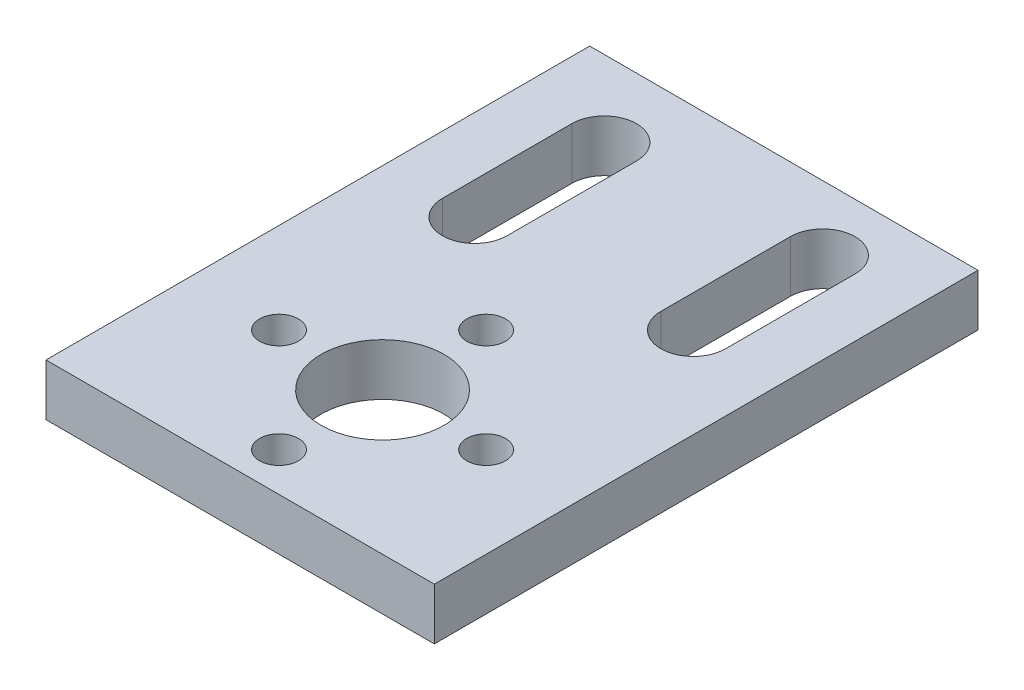
ISO-10303-21;
HEADER;
FILE_DESCRIPTION(('STEP AP214'),'2;1');
FILE_NAME('part.step','',(''),(''),'','','');
FILE_SCHEMA(('AUTOMOTIVE_DESIGN { 1 0 10303 214 1 1 1 1 }'));
ENDSEC;
DATA;
#1=APPLICATION_CONTEXT('core data for automotive mechanical design processes');
#2=APPLICATION_PROTOCOL_DEFINITION('international standard','automotive_design',2000,#1);
#3=PRODUCT_CONTEXT('',#1,'mechanical');
#4=PRODUCT('Part','Part','',(#3));
#5=PRODUCT_RELATED_PRODUCT_CATEGORY('part','',(#4));
#6=PRODUCT_DEFINITION_FORMATION('','',#4);
#7=PRODUCT_DEFINITION_CONTEXT('part definition',#1,'design');
#8=PRODUCT_DEFINITION('design','',#6,#7);
#9=PRODUCT_DEFINITION_SHAPE('','',#8);
#10=(LENGTH_UNIT() NAMED_UNIT(*) SI_UNIT(.MILLI.,.METRE.));
#11=(NAMED_UNIT(*) PLANE_ANGLE_UNIT() SI_UNIT($,.RADIAN.));
#12=(NAMED_UNIT(*) SI_UNIT($,.STERADIAN.) SOLID_ANGLE_UNIT());
#13=UNCERTAINTY_MEASURE_WITH_UNIT(LENGTH_MEASURE(1.E-05),#10,'distance_accuracy_value','');
#14=(GEOMETRIC_REPRESENTATION_CONTEXT(3) GLOBAL_UNCERTAINTY_ASSIGNED_CONTEXT((#13)) GLOBAL_UNIT_ASSIGNED_CONTEXT((#10,
#11,#12)) REPRESENTATION_CONTEXT('',''));
#15=CARTESIAN_POINT('',(0.,0.,0.));
#16=DIRECTION('',(0.,0.,1.));
#17=DIRECTION('',(1.,0.,0.));
#18=AXIS2_PLACEMENT_3D('',#15,#16,#17);
#19=CARTESIAN_POINT('',(0.,4.,0.));
#20=DIRECTION('',(0.,-1.,0.));
#21=DIRECTION('',(0.,0.,-1.));
#22=AXIS2_PLACEMENT_3D('',#19,#20,#21);
#23=PLANE('',#22);
#24=CARTESIAN_POINT('',(-7.99999999999989,4.,-14.1184202899468));
#25=DIRECTION('',(0.,1.,0.));
#26=DIRECTION('',(0.,0.,1.));
#27=AXIS2_PLACEMENT_3D('',#24,#25,#26);
#28=CIRCLE('',#27,2.5);
#29=CARTESIAN_POINT('',(-5.49999999999988,4.,-14.1184202899468));
#30=VERTEX_POINT('',#29);
#31=CARTESIAN_POINT('',(-10.4999999999999,4.,-14.1184202899468));
#32=VERTEX_POINT('',#31);
#33=EDGE_CURVE('E161',#30,#32,#28,.T.);
#34=ORIENTED_EDGE('',*,*,#33,.F.);
#35=DIRECTION('',(0.,0.,-1.));
#36=VECTOR('',#35,1.);
#37=CARTESIAN_POINT('',(-5.49999999999988,4.,-14.1184202899468));
#38=LINE('',#37,#36);
#39=CARTESIAN_POINT('',(-5.49999999999989,4.,-4.11842028994677));
#40=VERTEX_POINT('',#39);
#41=EDGE_CURVE('E169',#40,#30,#38,.T.);
#42=ORIENTED_EDGE('',*,*,#41,.F.);
#43=CARTESIAN_POINT('',(-7.99999999999989,4.,-4.11842028994677));
#44=DIRECTION('',(0.,1.,0.));
#45=DIRECTION('',(0.,0.,1.));
#46=AXIS2_PLACEMENT_3D('',#43,#44,#45);
#47=CIRCLE('',#46,2.5);
#48=CARTESIAN_POINT('',(-10.4999999999999,4.,-4.11842028994677));
#49=VERTEX_POINT('',#48);
#50=EDGE_CURVE('E166',#49,#40,#47,.T.);
#51=ORIENTED_EDGE('',*,*,#50,.F.);
#52=DIRECTION('',(0.,0.,1.));
#53=VECTOR('',#52,1.);
#54=CARTESIAN_POINT('',(-10.4999999999999,4.,-14.1184202899468));
#55=LINE('',#54,#53);
#56=EDGE_CURVE('E163',#32,#49,#55,.T.);
#57=ORIENTED_EDGE('',*,*,#56,.F.);
#58=EDGE_LOOP('',(#34,#42,#51,#57));
#59=FACE_BOUND('',#58,.T.);
#60=DIRECTION('',(0.,0.,1.));
#61=VECTOR('',#60,1.);
#62=CARTESIAN_POINT('',(-15.,4.,-20.));
#63=LINE('',#62,#61);
#64=CARTESIAN_POINT('',(-15.,4.,-20.));
#65=VERTEX_POINT('',#64);
#66=CARTESIAN_POINT('',(-15.,4.,22.));
#67=VERTEX_POINT('',#66);
#68=EDGE_CURVE('E222',#65,#67,#63,.T.);
#69=ORIENTED_EDGE('',*,*,#68,.T.);
#70=DIRECTION('',(1.,0.,0.));
#71=VECTOR('',#70,1.);
#72=CARTESIAN_POINT('',(15.,4.,22.));
#73=LINE('',#72,#71);
#74=CARTESIAN_POINT('',(15.,4.,22.));
#75=VERTEX_POINT('',#74);
#76=EDGE_CURVE('E225',#67,#75,#73,.T.);
#77=ORIENTED_EDGE('',*,*,#76,.T.);
#78=DIRECTION('',(0.,0.,-1.));
#79=VECTOR('',#78,1.);
#80=CARTESIAN_POINT('',(15.,4.,-20.));
#81=LINE('',#80,#79);
#82=CARTESIAN_POINT('',(15.,4.,-20.));
#83=VERTEX_POINT('',#82);
#84=EDGE_CURVE('E228',#75,#83,#81,.T.);
#85=ORIENTED_EDGE('',*,*,#84,.T.);
#86=DIRECTION('',(-1.,0.,0.));
#87=VECTOR('',#86,1.);
#88=CARTESIAN_POINT('',(15.,4.,-20.));
#89=LINE('',#88,#87);
#90=EDGE_CURVE('E230',#83,#65,#89,.T.);
#91=ORIENTED_EDGE('',*,*,#90,.T.);
#92=EDGE_LOOP('',(#69,#77,#85,#91));
#93=FACE_BOUND('',#92,.T.);
#94=CARTESIAN_POINT('',(0.,4.,11.));
#95=DIRECTION('',(0.,1.,0.));
#96=DIRECTION('',(0.,0.,1.));
#97=AXIS2_PLACEMENT_3D('',#94,#95,#96);
#98=CIRCLE('',#97,4.75);
#99=CARTESIAN_POINT('',(0.,4.,15.75));
#100=VERTEX_POINT('',#99);
#101=EDGE_CURVE('E216',#100,#100,#98,.T.);
#102=ORIENTED_EDGE('',*,*,#101,.F.);
#103=EDGE_LOOP('',(#102));
#104=FACE_BOUND('',#103,.T.);
#105=CARTESIAN_POINT('',(0.,4.,3.));
#106=DIRECTION('',(0.,1.,0.));
#107=DIRECTION('',(0.,0.,1.));
#108=AXIS2_PLACEMENT_3D('',#105,#106,#107);
#109=CIRCLE('',#108,1.5);
#110=CARTESIAN_POINT('',(0.,4.,4.5));
#111=VERTEX_POINT('',#110);
#112=EDGE_CURVE('E210',#111,#111,#109,.T.);
#113=ORIENTED_EDGE('',*,*,#112,.F.);
#114=EDGE_LOOP('',(#113));
#115=FACE_BOUND('',#114,.T.);
#116=CARTESIAN_POINT('',(8.00000000000011,4.,10.9999999999999));
#117=DIRECTION('',(0.,1.,0.));
#118=DIRECTION('',(0.,0.,1.));
#119=AXIS2_PLACEMENT_3D('',#116,#117,#118);
#120=CIRCLE('',#119,1.5);
#121=CARTESIAN_POINT('',(8.00000000000011,4.,12.4999999999999));
#122=VERTEX_POINT('',#121);
#123=EDGE_CURVE('E204',#122,#122,#120,.T.);
#124=ORIENTED_EDGE('',*,*,#123,.F.);
#125=EDGE_LOOP('',(#124));
#126=FACE_BOUND('',#125,.T.);
#127=CARTESIAN_POINT('',(1.68570821703788E-13,4.,19.));
#128=DIRECTION('',(0.,1.,0.));
#129=DIRECTION('',(0.,0.,1.));
#130=AXIS2_PLACEMENT_3D('',#127,#128,#129);
#131=CIRCLE('',#130,1.5);
#132=CARTESIAN_POINT('',(1.68570821703788E-13,4.,20.5));
#133=VERTEX_POINT('',#132);
#134=EDGE_CURVE('E198',#133,#133,#131,.T.);
#135=ORIENTED_EDGE('',*,*,#134,.F.);
#136=EDGE_LOOP('',(#135));
#137=FACE_BOUND('',#136,.T.);
#138=CARTESIAN_POINT('',(-7.99999999999989,4.,11.));
#139=DIRECTION('',(0.,1.,0.));
#140=DIRECTION('',(0.,0.,1.));
#141=AXIS2_PLACEMENT_3D('',#138,#139,#140);
#142=CIRCLE('',#141,1.5);
#143=CARTESIAN_POINT('',(-7.99999999999989,4.,12.5));
#144=VERTEX_POINT('',#143);
#145=EDGE_CURVE('E192',#144,#144,#142,.T.);
#146=ORIENTED_EDGE('',*,*,#145,.F.);
#147=EDGE_LOOP('',(#146));
#148=FACE_BOUND('',#147,.T.);
#149=CARTESIAN_POINT('',(8.00000000000012,4.,-15.));
#150=DIRECTION('',(0.,1.,0.));
#151=DIRECTION('',(0.,0.,1.));
#152=AXIS2_PLACEMENT_3D('',#149,#150,#151);
#153=CIRCLE('',#152,2.5);
#154=CARTESIAN_POINT('',(10.5000000000001,4.,-15.));
#155=VERTEX_POINT('',#154);
#156=CARTESIAN_POINT('',(5.50000000000011,4.,-15.));
#157=VERTEX_POINT('',#156);
#158=EDGE_CURVE('E125',#155,#157,#153,.T.);
#159=ORIENTED_EDGE('',*,*,#158,.F.);
#160=DIRECTION('',(0.,0.,-1.));
#161=VECTOR('',#160,1.);
#162=CARTESIAN_POINT('',(10.5000000000001,4.,-15.));
#163=LINE('',#162,#161);
#164=CARTESIAN_POINT('',(10.5000000000001,4.,-5.));
#165=VERTEX_POINT('',#164);
#166=EDGE_CURVE('E147',#165,#155,#163,.T.);
#167=ORIENTED_EDGE('',*,*,#166,.F.);
#168=CARTESIAN_POINT('',(8.00000000000012,4.,-5.));
#169=DIRECTION('',(0.,1.,0.));
#170=DIRECTION('',(0.,0.,1.));
#171=AXIS2_PLACEMENT_3D('',#168,#169,#170);
#172=CIRCLE('',#171,2.5);
#173=CARTESIAN_POINT('',(5.50000000000012,4.,-5.));
#174=VERTEX_POINT('',#173);
#175=EDGE_CURVE('E145',#174,#165,#172,.T.);
#176=ORIENTED_EDGE('',*,*,#175,.F.);
#177=DIRECTION('',(0.,0.,1.));
#178=VECTOR('',#177,1.);
#179=CARTESIAN_POINT('',(5.50000000000011,4.,-15.));
#180=LINE('',#179,#178);
#181=EDGE_CURVE('E133',#157,#174,#180,.T.);
#182=ORIENTED_EDGE('',*,*,#181,.F.);
#183=EDGE_LOOP('',(#159,#167,#176,#182));
#184=FACE_BOUND('',#183,.T.);
#185=ADVANCED_FACE('F36',(#59,#93,#104,#115,#126,#137,#148,#184),#23,.F.);
#186=CARTESIAN_POINT('',(0.,0.,0.));
#187=DIRECTION('',(0.,-1.,0.));
#188=DIRECTION('',(0.,0.,-1.));
#189=AXIS2_PLACEMENT_3D('',#186,#187,#188);
#190=PLANE('',#189);
#191=CARTESIAN_POINT('',(1.68570821703788E-13,0.,19.));
#192=DIRECTION('',(0.,1.,0.));
#193=DIRECTION('',(0.,0.,1.));
#194=AXIS2_PLACEMENT_3D('',#191,#192,#193);
#195=CIRCLE('',#194,1.5);
#196=CARTESIAN_POINT('',(1.68570821703788E-13,0.,20.5));
#197=VERTEX_POINT('',#196);
#198=EDGE_CURVE('E195',#197,#197,#195,.T.);
#199=ORIENTED_EDGE('',*,*,#198,.T.);
#200=EDGE_LOOP('',(#199));
#201=FACE_BOUND('',#200,.T.);
#202=CARTESIAN_POINT('',(0.,0.,3.));
#203=DIRECTION('',(0.,1.,0.));
#204=DIRECTION('',(0.,0.,1.));
#205=AXIS2_PLACEMENT_3D('',#202,#203,#204);
#206=CIRCLE('',#205,1.5);
#207=CARTESIAN_POINT('',(0.,0.,4.5));
#208=VERTEX_POINT('',#207);
#209=EDGE_CURVE('E207',#208,#208,#206,.T.);
#210=ORIENTED_EDGE('',*,*,#209,.T.);
#211=EDGE_LOOP('',(#210));
#212=FACE_BOUND('',#211,.T.);
#213=DIRECTION('',(0.,0.,1.));
#214=VECTOR('',#213,1.);
#215=CARTESIAN_POINT('',(-15.,0.,-20.));
#216=LINE('',#215,#214);
#217=CARTESIAN_POINT('',(-15.,0.,-20.));
#218=VERTEX_POINT('',#217);
#219=CARTESIAN_POINT('',(-15.,0.,22.));
#220=VERTEX_POINT('',#219);
#221=EDGE_CURVE('E219',#218,#220,#216,.T.);
#222=ORIENTED_EDGE('',*,*,#221,.F.);
#223=DIRECTION('',(-1.,0.,0.));
#224=VECTOR('',#223,1.);
#225=CARTESIAN_POINT('',(15.,0.,-20.));
#226=LINE('',#225,#224);
#227=CARTESIAN_POINT('',(15.,0.,-20.));
#228=VERTEX_POINT('',#227);
#229=EDGE_CURVE('E226',#228,#218,#226,.T.);
#230=ORIENTED_EDGE('',*,*,#229,.F.);
#231=DIRECTION('',(0.,0.,-1.));
#232=VECTOR('',#231,1.);
#233=CARTESIAN_POINT('',(15.,0.,-20.));
#234=LINE('',#233,#232);
#235=CARTESIAN_POINT('',(15.,0.,22.));
#236=VERTEX_POINT('',#235);
#237=EDGE_CURVE('E237',#236,#228,#234,.T.);
#238=ORIENTED_EDGE('',*,*,#237,.F.);
#239=DIRECTION('',(1.,0.,0.));
#240=VECTOR('',#239,1.);
#241=CARTESIAN_POINT('',(15.,0.,22.));
#242=LINE('',#241,#240);
#243=EDGE_CURVE('E235',#220,#236,#242,.T.);
#244=ORIENTED_EDGE('',*,*,#243,.F.);
#245=EDGE_LOOP('',(#222,#230,#238,#244));
#246=FACE_BOUND('',#245,.T.);
#247=CARTESIAN_POINT('',(0.,0.,11.));
#248=DIRECTION('',(0.,1.,0.));
#249=DIRECTION('',(0.,0.,1.));
#250=AXIS2_PLACEMENT_3D('',#247,#248,#249);
#251=CIRCLE('',#250,4.75);
#252=CARTESIAN_POINT('',(0.,0.,15.75));
#253=VERTEX_POINT('',#252);
#254=EDGE_CURVE('E213',#253,#253,#251,.T.);
#255=ORIENTED_EDGE('',*,*,#254,.T.);
#256=EDGE_LOOP('',(#255));
#257=FACE_BOUND('',#256,.T.);
#258=CARTESIAN_POINT('',(8.00000000000011,0.,10.9999999999999));
#259=DIRECTION('',(0.,1.,0.));
#260=DIRECTION('',(0.,0.,1.));
#261=AXIS2_PLACEMENT_3D('',#258,#259,#260);
#262=CIRCLE('',#261,1.5);
#263=CARTESIAN_POINT('',(8.00000000000011,0.,12.4999999999999));
#264=VERTEX_POINT('',#263);
#265=EDGE_CURVE('E201',#264,#264,#262,.T.);
#266=ORIENTED_EDGE('',*,*,#265,.T.);
#267=EDGE_LOOP('',(#266));
#268=FACE_BOUND('',#267,.T.);
#269=CARTESIAN_POINT('',(-7.99999999999989,0.,11.));
#270=DIRECTION('',(0.,1.,0.));
#271=DIRECTION('',(0.,0.,1.));
#272=AXIS2_PLACEMENT_3D('',#269,#270,#271);
#273=CIRCLE('',#272,1.5);
#274=CARTESIAN_POINT('',(-7.99999999999989,0.,12.5));
#275=VERTEX_POINT('',#274);
#276=EDGE_CURVE('E191',#275,#275,#273,.T.);
#277=ORIENTED_EDGE('',*,*,#276,.T.);
#278=EDGE_LOOP('',(#277));
#279=FACE_BOUND('',#278,.T.);
#280=DIRECTION('',(0.,0.,-1.));
#281=VECTOR('',#280,1.);
#282=CARTESIAN_POINT('',(-5.49999999999988,0.,-14.1184202899468));
#283=LINE('',#282,#281);
#284=CARTESIAN_POINT('',(-5.49999999999989,0.,-4.11842028994677));
#285=VERTEX_POINT('',#284);
#286=CARTESIAN_POINT('',(-5.49999999999988,0.,-14.1184202899468));
#287=VERTEX_POINT('',#286);
#288=EDGE_CURVE('E164',#285,#287,#283,.T.);
#289=ORIENTED_EDGE('',*,*,#288,.T.);
#290=CARTESIAN_POINT('',(-7.99999999999989,0.,-14.1184202899468));
#291=DIRECTION('',(0.,1.,0.));
#292=DIRECTION('',(0.,0.,1.));
#293=AXIS2_PLACEMENT_3D('',#290,#291,#292);
#294=CIRCLE('',#293,2.5);
#295=CARTESIAN_POINT('',(-10.4999999999999,0.,-14.1184202899468));
#296=VERTEX_POINT('',#295);
#297=EDGE_CURVE('E141',#287,#296,#294,.T.);
#298=ORIENTED_EDGE('',*,*,#297,.T.);
#299=DIRECTION('',(0.,0.,1.));
#300=VECTOR('',#299,1.);
#301=CARTESIAN_POINT('',(-10.4999999999999,0.,-14.1184202899468));
#302=LINE('',#301,#300);
#303=CARTESIAN_POINT('',(-10.4999999999999,0.,-4.11842028994677));
#304=VERTEX_POINT('',#303);
#305=EDGE_CURVE('E174',#296,#304,#302,.T.);
#306=ORIENTED_EDGE('',*,*,#305,.T.);
#307=CARTESIAN_POINT('',(-7.99999999999989,0.,-4.11842028994677));
#308=DIRECTION('',(0.,1.,0.));
#309=DIRECTION('',(0.,0.,1.));
#310=AXIS2_PLACEMENT_3D('',#307,#308,#309);
#311=CIRCLE('',#310,2.5);
#312=EDGE_CURVE('E177',#304,#285,#311,.T.);
#313=ORIENTED_EDGE('',*,*,#312,.T.);
#314=EDGE_LOOP('',(#289,#298,#306,#313));
#315=FACE_BOUND('',#314,.T.);
#316=DIRECTION('',(0.,0.,-1.));
#317=VECTOR('',#316,1.);
#318=CARTESIAN_POINT('',(10.5000000000001,0.,-15.));
#319=LINE('',#318,#317);
#320=CARTESIAN_POINT('',(10.5000000000001,0.,-5.));
#321=VERTEX_POINT('',#320);
#322=CARTESIAN_POINT('',(10.5000000000001,0.,-15.));
#323=VERTEX_POINT('',#322);
#324=EDGE_CURVE('E134',#321,#323,#319,.T.);
#325=ORIENTED_EDGE('',*,*,#324,.T.);
#326=CARTESIAN_POINT('',(8.00000000000012,0.,-15.));
#327=DIRECTION('',(0.,1.,0.));
#328=DIRECTION('',(0.,0.,1.));
#329=AXIS2_PLACEMENT_3D('',#326,#327,#328);
#330=CIRCLE('',#329,2.5);
#331=CARTESIAN_POINT('',(5.50000000000011,0.,-15.));
#332=VERTEX_POINT('',#331);
#333=EDGE_CURVE('E59',#323,#332,#330,.T.);
#334=ORIENTED_EDGE('',*,*,#333,.T.);
#335=DIRECTION('',(0.,0.,1.));
#336=VECTOR('',#335,1.);
#337=CARTESIAN_POINT('',(5.50000000000011,0.,-15.));
#338=LINE('',#337,#336);
#339=CARTESIAN_POINT('',(5.50000000000012,0.,-5.));
#340=VERTEX_POINT('',#339);
#341=EDGE_CURVE('E140',#332,#340,#338,.T.);
#342=ORIENTED_EDGE('',*,*,#341,.T.);
#343=CARTESIAN_POINT('',(8.00000000000012,0.,-5.));
#344=DIRECTION('',(0.,1.,0.));
#345=DIRECTION('',(0.,0.,1.));
#346=AXIS2_PLACEMENT_3D('',#343,#344,#345);
#347=CIRCLE('',#346,2.5);
#348=EDGE_CURVE('E153',#340,#321,#347,.T.);
#349=ORIENTED_EDGE('',*,*,#348,.T.);
#350=EDGE_LOOP('',(#325,#334,#342,#349));
#351=FACE_BOUND('',#350,.T.);
#352=ADVANCED_FACE('F255',(#201,#212,#246,#257,#268,#279,#315,#351),#190,.T.);
#353=CARTESIAN_POINT('',(-15.,4.,-20.));
#354=DIRECTION('',(1.,0.,0.));
#355=DIRECTION('',(0.,0.,-1.));
#356=AXIS2_PLACEMENT_3D('',#353,#354,#355);
#357=PLANE('',#356);
#358=ORIENTED_EDGE('',*,*,#221,.T.);
#359=DIRECTION('',(0.,-1.,0.));
#360=VECTOR('',#359,1.);
#361=CARTESIAN_POINT('',(-15.,4.,22.));
#362=LINE('',#361,#360);
#363=EDGE_CURVE('E11',#67,#220,#362,.T.);
#364=ORIENTED_EDGE('',*,*,#363,.F.);
#365=ORIENTED_EDGE('',*,*,#68,.F.);
#366=DIRECTION('',(0.,-1.,0.));
#367=VECTOR('',#366,1.);
#368=CARTESIAN_POINT('',(-15.,4.,-20.));
#369=LINE('',#368,#367);
#370=EDGE_CURVE('E232',#65,#218,#369,.T.);
#371=ORIENTED_EDGE('',*,*,#370,.T.);
#372=EDGE_LOOP('',(#358,#364,#365,#371));
#373=FACE_BOUND('',#372,.T.);
#374=ADVANCED_FACE('F38',(#373),#357,.F.);
#375=CARTESIAN_POINT('',(15.,4.,22.));
#376=DIRECTION('',(0.,0.,-1.));
#377=DIRECTION('',(-1.,0.,0.));
#378=AXIS2_PLACEMENT_3D('',#375,#376,#377);
#379=PLANE('',#378);
#380=ORIENTED_EDGE('',*,*,#243,.T.);
#381=DIRECTION('',(0.,-1.,0.));
#382=VECTOR('',#381,1.);
#383=CARTESIAN_POINT('',(15.,4.,22.));
#384=LINE('',#383,#382);
#385=EDGE_CURVE('E44',#75,#236,#384,.T.);
#386=ORIENTED_EDGE('',*,*,#385,.F.);
#387=ORIENTED_EDGE('',*,*,#76,.F.);
#388=ORIENTED_EDGE('',*,*,#363,.T.);
#389=EDGE_LOOP('',(#380,#386,#387,#388));
#390=FACE_BOUND('',#389,.T.);
#391=ADVANCED_FACE('F266',(#390),#379,.F.);
#392=CARTESIAN_POINT('',(15.,4.,-20.));
#393=DIRECTION('',(-1.,0.,0.));
#394=DIRECTION('',(0.,0.,1.));
#395=AXIS2_PLACEMENT_3D('',#392,#393,#394);
#396=PLANE('',#395);
#397=ORIENTED_EDGE('',*,*,#237,.T.);
#398=DIRECTION('',(0.,-1.,0.));
#399=VECTOR('',#398,1.);
#400=CARTESIAN_POINT('',(15.,4.,-20.));
#401=LINE('',#400,#399);
#402=EDGE_CURVE('E242',#83,#228,#401,.T.);
#403=ORIENTED_EDGE('',*,*,#402,.F.);
#404=ORIENTED_EDGE('',*,*,#84,.F.);
#405=ORIENTED_EDGE('',*,*,#385,.T.);
#406=EDGE_LOOP('',(#397,#403,#404,#405));
#407=FACE_BOUND('',#406,.T.);
#408=ADVANCED_FACE('F249',(#407),#396,.F.);
#409=CARTESIAN_POINT('',(15.,4.,-20.));
#410=DIRECTION('',(0.,0.,1.));
#411=DIRECTION('',(1.,0.,0.));
#412=AXIS2_PLACEMENT_3D('',#409,#410,#411);
#413=PLANE('',#412);
#414=ORIENTED_EDGE('',*,*,#229,.T.);
#415=ORIENTED_EDGE('',*,*,#370,.F.);
#416=ORIENTED_EDGE('',*,*,#90,.F.);
#417=ORIENTED_EDGE('',*,*,#402,.T.);
#418=EDGE_LOOP('',(#414,#415,#416,#417));
#419=FACE_BOUND('',#418,.T.);
#420=ADVANCED_FACE('F259',(#419),#413,.F.);
#421=CARTESIAN_POINT('',(0.,4.,11.));
#422=DIRECTION('',(0.,-1.,0.));
#423=DIRECTION('',(0.,0.,-1.));
#424=AXIS2_PLACEMENT_3D('',#421,#422,#423);
#425=CYLINDRICAL_SURFACE('',#424,4.75);
#426=ORIENTED_EDGE('',*,*,#101,.T.);
#427=EDGE_LOOP('',(#426));
#428=FACE_BOUND('',#427,.T.);
#429=ORIENTED_EDGE('',*,*,#254,.F.);
#430=EDGE_LOOP('',(#429));
#431=FACE_BOUND('',#430,.T.);
#432=ADVANCED_FACE('F283',(#428,#431),#425,.F.);
#433=CARTESIAN_POINT('',(0.,4.,3.));
#434=DIRECTION('',(0.,-1.,0.));
#435=DIRECTION('',(0.,0.,-1.));
#436=AXIS2_PLACEMENT_3D('',#433,#434,#435);
#437=CYLINDRICAL_SURFACE('',#436,1.5);
#438=ORIENTED_EDGE('',*,*,#112,.T.);
#439=EDGE_LOOP('',(#438));
#440=FACE_BOUND('',#439,.T.);
#441=ORIENTED_EDGE('',*,*,#209,.F.);
#442=EDGE_LOOP('',(#441));
#443=FACE_BOUND('',#442,.T.);
#444=ADVANCED_FACE('F290',(#440,#443),#437,.F.);
#445=CARTESIAN_POINT('',(8.00000000000011,4.,10.9999999999999));
#446=DIRECTION('',(0.,-1.,0.));
#447=DIRECTION('',(0.,0.,-1.));
#448=AXIS2_PLACEMENT_3D('',#445,#446,#447);
#449=CYLINDRICAL_SURFACE('',#448,1.5);
#450=ORIENTED_EDGE('',*,*,#123,.T.);
#451=EDGE_LOOP('',(#450));
#452=FACE_BOUND('',#451,.T.);
#453=ORIENTED_EDGE('',*,*,#265,.F.);
#454=EDGE_LOOP('',(#453));
#455=FACE_BOUND('',#454,.T.);
#456=ADVANCED_FACE('F295',(#452,#455),#449,.F.);
#457=CARTESIAN_POINT('',(1.68570821703788E-13,4.,19.));
#458=DIRECTION('',(0.,-1.,0.));
#459=DIRECTION('',(0.,0.,-1.));
#460=AXIS2_PLACEMENT_3D('',#457,#458,#459);
#461=CYLINDRICAL_SURFACE('',#460,1.5);
#462=ORIENTED_EDGE('',*,*,#134,.T.);
#463=EDGE_LOOP('',(#462));
#464=FACE_BOUND('',#463,.T.);
#465=ORIENTED_EDGE('',*,*,#198,.F.);
#466=EDGE_LOOP('',(#465));
#467=FACE_BOUND('',#466,.T.);
#468=ADVANCED_FACE('F341',(#464,#467),#461,.F.);
#469=CARTESIAN_POINT('',(-7.99999999999989,4.,11.));
#470=DIRECTION('',(0.,-1.,0.));
#471=DIRECTION('',(0.,0.,-1.));
#472=AXIS2_PLACEMENT_3D('',#469,#470,#471);
#473=CYLINDRICAL_SURFACE('',#472,1.5);
#474=ORIENTED_EDGE('',*,*,#145,.T.);
#475=EDGE_LOOP('',(#474));
#476=FACE_BOUND('',#475,.T.);
#477=ORIENTED_EDGE('',*,*,#276,.F.);
#478=EDGE_LOOP('',(#477));
#479=FACE_BOUND('',#478,.T.);
#480=ADVANCED_FACE('F337',(#476,#479),#473,.F.);
#481=CARTESIAN_POINT('',(-7.99999999999989,4.,-14.1184202899468));
#482=DIRECTION('',(0.,-1.,0.));
#483=DIRECTION('',(0.,0.,-1.));
#484=AXIS2_PLACEMENT_3D('',#481,#482,#483);
#485=CYLINDRICAL_SURFACE('',#484,2.5);
#486=ORIENTED_EDGE('',*,*,#297,.F.);
#487=DIRECTION('',(0.,-1.,0.));
#488=VECTOR('',#487,1.);
#489=CARTESIAN_POINT('',(-5.49999999999988,4.,-14.1184202899468));
#490=LINE('',#489,#488);
#491=EDGE_CURVE('E171',#30,#287,#490,.T.);
#492=ORIENTED_EDGE('',*,*,#491,.F.);
#493=ORIENTED_EDGE('',*,*,#33,.T.);
#494=DIRECTION('',(0.,-1.,0.));
#495=VECTOR('',#494,1.);
#496=CARTESIAN_POINT('',(-10.4999999999999,4.,-14.1184202899468));
#497=LINE('',#496,#495);
#498=EDGE_CURVE('E188',#32,#296,#497,.T.);
#499=ORIENTED_EDGE('',*,*,#498,.T.);
#500=EDGE_LOOP('',(#486,#492,#493,#499));
#501=FACE_BOUND('',#500,.T.);
#502=ADVANCED_FACE('F333',(#501),#485,.F.);
#503=CARTESIAN_POINT('',(-10.4999999999999,4.,-14.1184202899468));
#504=DIRECTION('',(1.,0.,0.));
#505=DIRECTION('',(0.,0.,-1.));
#506=AXIS2_PLACEMENT_3D('',#503,#504,#505);
#507=PLANE('',#506);
#508=ORIENTED_EDGE('',*,*,#305,.F.);
#509=ORIENTED_EDGE('',*,*,#498,.F.);
#510=ORIENTED_EDGE('',*,*,#56,.T.);
#511=DIRECTION('',(0.,-1.,0.));
#512=VECTOR('',#511,1.);
#513=CARTESIAN_POINT('',(-10.4999999999999,4.,-4.11842028994677));
#514=LINE('',#513,#512);
#515=EDGE_CURVE('E186',#49,#304,#514,.T.);
#516=ORIENTED_EDGE('',*,*,#515,.T.);
#517=EDGE_LOOP('',(#508,#509,#510,#516));
#518=FACE_BOUND('',#517,.T.);
#519=ADVANCED_FACE('F329',(#518),#507,.T.);
#520=CARTESIAN_POINT('',(-7.99999999999989,4.,-4.11842028994677));
#521=DIRECTION('',(0.,-1.,0.));
#522=DIRECTION('',(0.,0.,-1.));
#523=AXIS2_PLACEMENT_3D('',#520,#521,#522);
#524=CYLINDRICAL_SURFACE('',#523,2.5);
#525=ORIENTED_EDGE('',*,*,#312,.F.);
#526=ORIENTED_EDGE('',*,*,#515,.F.);
#527=ORIENTED_EDGE('',*,*,#50,.T.);
#528=DIRECTION('',(0.,-1.,0.));
#529=VECTOR('',#528,1.);
#530=CARTESIAN_POINT('',(-5.49999999999989,4.,-4.11842028994677));
#531=LINE('',#530,#529);
#532=EDGE_CURVE('E184',#40,#285,#531,.T.);
#533=ORIENTED_EDGE('',*,*,#532,.T.);
#534=EDGE_LOOP('',(#525,#526,#527,#533));
#535=FACE_BOUND('',#534,.T.);
#536=ADVANCED_FACE('F325',(#535),#524,.F.);
#537=CARTESIAN_POINT('',(-5.49999999999988,4.,-14.1184202899468));
#538=DIRECTION('',(-1.,0.,0.));
#539=DIRECTION('',(0.,0.,1.));
#540=AXIS2_PLACEMENT_3D('',#537,#538,#539);
#541=PLANE('',#540);
#542=ORIENTED_EDGE('',*,*,#288,.F.);
#543=ORIENTED_EDGE('',*,*,#532,.F.);
#544=ORIENTED_EDGE('',*,*,#41,.T.);
#545=ORIENTED_EDGE('',*,*,#491,.T.);
#546=EDGE_LOOP('',(#542,#543,#544,#545));
#547=FACE_BOUND('',#546,.T.);
#548=ADVANCED_FACE('F322',(#547),#541,.T.);
#549=CARTESIAN_POINT('',(8.00000000000012,4.,-15.));
#550=DIRECTION('',(0.,-1.,0.));
#551=DIRECTION('',(0.,0.,-1.));
#552=AXIS2_PLACEMENT_3D('',#549,#550,#551);
#553=CYLINDRICAL_SURFACE('',#552,2.5);
#554=ORIENTED_EDGE('',*,*,#333,.F.);
#555=DIRECTION('',(0.,-1.,0.));
#556=VECTOR('',#555,1.);
#557=CARTESIAN_POINT('',(10.5000000000001,4.,-15.));
#558=LINE('',#557,#556);
#559=EDGE_CURVE('E129',#155,#323,#558,.T.);
#560=ORIENTED_EDGE('',*,*,#559,.F.);
#561=ORIENTED_EDGE('',*,*,#158,.T.);
#562=DIRECTION('',(0.,-1.,0.));
#563=VECTOR('',#562,1.);
#564=CARTESIAN_POINT('',(5.50000000000011,4.,-15.));
#565=LINE('',#564,#563);
#566=EDGE_CURVE('E128',#157,#332,#565,.T.);
#567=ORIENTED_EDGE('',*,*,#566,.T.);
#568=EDGE_LOOP('',(#554,#560,#561,#567));
#569=FACE_BOUND('',#568,.T.);
#570=ADVANCED_FACE('F127',(#569),#553,.F.);
#571=CARTESIAN_POINT('',(5.50000000000011,4.,-15.));
#572=DIRECTION('',(1.,0.,0.));
#573=DIRECTION('',(0.,0.,-1.));
#574=AXIS2_PLACEMENT_3D('',#571,#572,#573);
#575=PLANE('',#574);
#576=ORIENTED_EDGE('',*,*,#341,.F.);
#577=ORIENTED_EDGE('',*,*,#566,.F.);
#578=ORIENTED_EDGE('',*,*,#181,.T.);
#579=DIRECTION('',(0.,-1.,0.));
#580=VECTOR('',#579,1.);
#581=CARTESIAN_POINT('',(5.50000000000012,4.,-5.));
#582=LINE('',#581,#580);
#583=EDGE_CURVE('E142',#174,#340,#582,.T.);
#584=ORIENTED_EDGE('',*,*,#583,.T.);
#585=EDGE_LOOP('',(#576,#577,#578,#584));
#586=FACE_BOUND('',#585,.T.);
#587=ADVANCED_FACE('F137',(#586),#575,.T.);
#588=CARTESIAN_POINT('',(8.00000000000012,4.,-5.));
#589=DIRECTION('',(0.,-1.,0.));
#590=DIRECTION('',(0.,0.,-1.));
#591=AXIS2_PLACEMENT_3D('',#588,#589,#590);
#592=CYLINDRICAL_SURFACE('',#591,2.5);
#593=ORIENTED_EDGE('',*,*,#348,.F.);
#594=ORIENTED_EDGE('',*,*,#583,.F.);
#595=ORIENTED_EDGE('',*,*,#175,.T.);
#596=DIRECTION('',(0.,-1.,0.));
#597=VECTOR('',#596,1.);
#598=CARTESIAN_POINT('',(10.5000000000001,4.,-5.));
#599=LINE('',#598,#597);
#600=EDGE_CURVE('E51',#165,#321,#599,.T.);
#601=ORIENTED_EDGE('',*,*,#600,.T.);
#602=EDGE_LOOP('',(#593,#594,#595,#601));
#603=FACE_BOUND('',#602,.T.);
#604=ADVANCED_FACE('F310',(#603),#592,.F.);
#605=CARTESIAN_POINT('',(10.5000000000001,4.,-15.));
#606=DIRECTION('',(-1.,0.,0.));
#607=DIRECTION('',(0.,0.,1.));
#608=AXIS2_PLACEMENT_3D('',#605,#606,#607);
#609=PLANE('',#608);
#610=ORIENTED_EDGE('',*,*,#324,.F.);
#611=ORIENTED_EDGE('',*,*,#600,.F.);
#612=ORIENTED_EDGE('',*,*,#166,.T.);
#613=ORIENTED_EDGE('',*,*,#559,.T.);
#614=EDGE_LOOP('',(#610,#611,#612,#613));
#615=FACE_BOUND('',#614,.T.);
#616=ADVANCED_FACE('F308',(#615),#609,.T.);
#617=CLOSED_SHELL('',(#185,#352,#374,#391,#408,#420,#432,#444,#456,#468,#480,#502,#519,#536,
#548,#570,#587,#604,#616));
#618=MANIFOLD_SOLID_BREP('B2',#617);
#619=ADVANCED_BREP_SHAPE_REPRESENTATION('',(#18,#618),#14);
#620=SHAPE_DEFINITION_REPRESENTATION(#9,#619);
ENDSEC;
END-ISO-10303-21;
